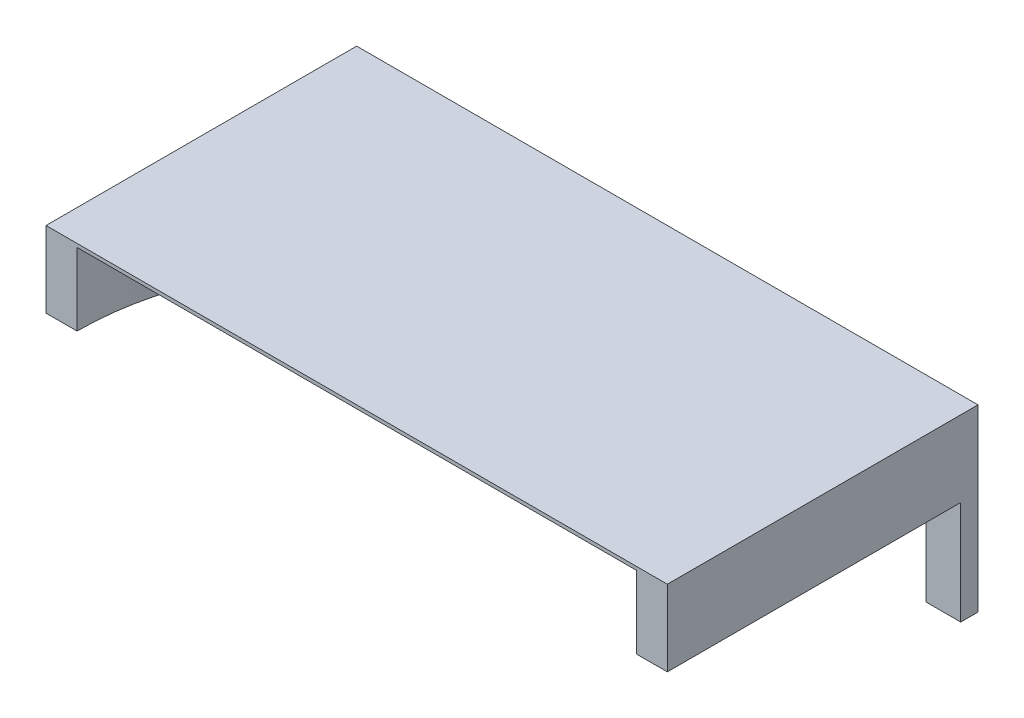
ISO-10303-21;
HEADER;
FILE_DESCRIPTION(('STEP AP214'),'2;1');
FILE_NAME('part.step','',(''),(''),'','','');
FILE_SCHEMA(('AUTOMOTIVE_DESIGN { 1 0 10303 214 1 1 1 1 }'));
ENDSEC;
DATA;
#1=APPLICATION_CONTEXT('core data for automotive mechanical design processes');
#2=APPLICATION_PROTOCOL_DEFINITION('international standard','automotive_design',2000,#1);
#3=PRODUCT_CONTEXT('',#1,'mechanical');
#4=PRODUCT('Part','Part','',(#3));
#5=PRODUCT_RELATED_PRODUCT_CATEGORY('part','',(#4));
#6=PRODUCT_DEFINITION_FORMATION('','',#4);
#7=PRODUCT_DEFINITION_CONTEXT('part definition',#1,'design');
#8=PRODUCT_DEFINITION('design','',#6,#7);
#9=PRODUCT_DEFINITION_SHAPE('','',#8);
#10=(LENGTH_UNIT() NAMED_UNIT(*) SI_UNIT(.MILLI.,.METRE.));
#11=(NAMED_UNIT(*) PLANE_ANGLE_UNIT() SI_UNIT($,.RADIAN.));
#12=(NAMED_UNIT(*) SI_UNIT($,.STERADIAN.) SOLID_ANGLE_UNIT());
#13=UNCERTAINTY_MEASURE_WITH_UNIT(LENGTH_MEASURE(1.E-05),#10,'distance_accuracy_value','');
#14=(GEOMETRIC_REPRESENTATION_CONTEXT(3) GLOBAL_UNCERTAINTY_ASSIGNED_CONTEXT((#13)) GLOBAL_UNIT_ASSIGNED_CONTEXT((#10,
#11,#12)) REPRESENTATION_CONTEXT('',''));
#15=CARTESIAN_POINT('',(0.,0.,0.));
#16=DIRECTION('',(0.,0.,1.));
#17=DIRECTION('',(1.,0.,0.));
#18=AXIS2_PLACEMENT_3D('',#15,#16,#17);
#19=CARTESIAN_POINT('',(0.,0.,90.));
#20=DIRECTION('',(0.,1.,0.));
#21=DIRECTION('',(0.,0.,1.));
#22=AXIS2_PLACEMENT_3D('',#19,#20,#21);
#23=PLANE('',#22);
#24=DIRECTION('',(-1.,0.,0.));
#25=VECTOR('',#24,1.);
#26=CARTESIAN_POINT('',(90.,0.,0.));
#27=LINE('',#26,#25);
#28=CARTESIAN_POINT('',(70.,0.,0.));
#29=VERTEX_POINT('',#28);
#30=CARTESIAN_POINT('',(-70.,0.,0.));
#31=VERTEX_POINT('',#30);
#32=EDGE_CURVE('E230',#29,#31,#27,.T.);
#33=ORIENTED_EDGE('',*,*,#32,.F.);
#34=DIRECTION('',(0.,0.,-1.));
#35=VECTOR('',#34,1.);
#36=CARTESIAN_POINT('',(70.,0.,5.));
#37=LINE('',#36,#35);
#38=CARTESIAN_POINT('',(70.,0.,5.));
#39=VERTEX_POINT('',#38);
#40=EDGE_CURVE('E270',#29,#39,#37,.F.);
#41=ORIENTED_EDGE('',*,*,#40,.T.);
#42=DIRECTION('',(-1.,0.,0.));
#43=VECTOR('',#42,1.);
#44=CARTESIAN_POINT('',(90.,0.,5.));
#45=LINE('',#44,#43);
#46=CARTESIAN_POINT('',(90.,0.,5.));
#47=VERTEX_POINT('',#46);
#48=EDGE_CURVE('E163',#47,#39,#45,.T.);
#49=ORIENTED_EDGE('',*,*,#48,.F.);
#50=DIRECTION('',(0.,0.,-1.));
#51=VECTOR('',#50,1.);
#52=CARTESIAN_POINT('',(90.,0.,90.));
#53=LINE('',#52,#51);
#54=CARTESIAN_POINT('',(90.,0.,90.));
#55=VERTEX_POINT('',#54);
#56=EDGE_CURVE('E168',#55,#47,#53,.T.);
#57=ORIENTED_EDGE('',*,*,#56,.F.);
#58=DIRECTION('',(1.,0.,0.));
#59=VECTOR('',#58,1.);
#60=CARTESIAN_POINT('',(81.,0.,90.));
#61=LINE('',#60,#59);
#62=CARTESIAN_POINT('',(81.,0.,90.));
#63=VERTEX_POINT('',#62);
#64=EDGE_CURVE('E208',#63,#55,#61,.T.);
#65=ORIENTED_EDGE('',*,*,#64,.F.);
#66=CARTESIAN_POINT('',(0.,0.,90.));
#67=DIRECTION('',(0.,1.,0.));
#68=DIRECTION('',(0.,0.,1.));
#69=AXIS2_PLACEMENT_3D('',#66,#67,#68);
#70=CIRCLE('',#69,81.);
#71=CARTESIAN_POINT('',(-81.,0.,90.));
#72=VERTEX_POINT('',#71);
#73=EDGE_CURVE('E214',#63,#72,#70,.T.);
#74=ORIENTED_EDGE('',*,*,#73,.T.);
#75=DIRECTION('',(-1.,0.,0.));
#76=VECTOR('',#75,1.);
#77=CARTESIAN_POINT('',(-81.,0.,90.));
#78=LINE('',#77,#76);
#79=CARTESIAN_POINT('',(-90.,0.,90.));
#80=VERTEX_POINT('',#79);
#81=EDGE_CURVE('E236',#72,#80,#78,.T.);
#82=ORIENTED_EDGE('',*,*,#81,.T.);
#83=DIRECTION('',(0.,0.,-1.));
#84=VECTOR('',#83,1.);
#85=CARTESIAN_POINT('',(-90.,0.,90.));
#86=LINE('',#85,#84);
#87=CARTESIAN_POINT('',(-90.,0.,5.00000000000006));
#88=VERTEX_POINT('',#87);
#89=EDGE_CURVE('E233',#80,#88,#86,.T.);
#90=ORIENTED_EDGE('',*,*,#89,.T.);
#91=DIRECTION('',(-1.,0.,0.));
#92=VECTOR('',#91,1.);
#93=CARTESIAN_POINT('',(-90.,0.,5.00000000000003));
#94=LINE('',#93,#92);
#95=CARTESIAN_POINT('',(-70.,0.,5.00000000000003));
#96=VERTEX_POINT('',#95);
#97=EDGE_CURVE('E170',#96,#88,#94,.T.);
#98=ORIENTED_EDGE('',*,*,#97,.F.);
#99=DIRECTION('',(0.,0.,1.));
#100=VECTOR('',#99,1.);
#101=CARTESIAN_POINT('',(-70.,0.,0.));
#102=LINE('',#101,#100);
#103=EDGE_CURVE('E267',#96,#31,#102,.F.);
#104=ORIENTED_EDGE('',*,*,#103,.T.);
#105=EDGE_LOOP('',(#33,#41,#49,#57,#65,#74,#82,#90,#98,#104));
#106=FACE_BOUND('',#105,.T.);
#107=ADVANCED_FACE('F39',(#106),#23,.F.);
#108=CARTESIAN_POINT('',(0.,22.,90.));
#109=DIRECTION('',(0.,-1.,0.));
#110=DIRECTION('',(0.,0.,-1.));
#111=AXIS2_PLACEMENT_3D('',#108,#109,#110);
#112=CYLINDRICAL_SURFACE('',#111,81.);
#113=DIRECTION('',(0.,-1.,0.));
#114=VECTOR('',#113,1.);
#115=CARTESIAN_POINT('',(81.,22.,90.));
#116=LINE('',#115,#114);
#117=CARTESIAN_POINT('',(81.,21.,90.));
#118=VERTEX_POINT('',#117);
#119=EDGE_CURVE('E224',#118,#63,#116,.T.);
#120=ORIENTED_EDGE('',*,*,#119,.F.);
#121=CARTESIAN_POINT('',(0.,21.,90.));
#122=DIRECTION('',(0.,1.,0.));
#123=DIRECTION('',(0.,0.,1.));
#124=AXIS2_PLACEMENT_3D('',#121,#122,#123);
#125=CIRCLE('',#124,81.);
#126=CARTESIAN_POINT('',(-81.,21.,90.));
#127=VERTEX_POINT('',#126);
#128=EDGE_CURVE('E260',#118,#127,#125,.T.);
#129=ORIENTED_EDGE('',*,*,#128,.T.);
#130=DIRECTION('',(0.,-1.,0.));
#131=VECTOR('',#130,1.);
#132=CARTESIAN_POINT('',(-81.,22.,90.));
#133=LINE('',#132,#131);
#134=EDGE_CURVE('E245',#127,#72,#133,.T.);
#135=ORIENTED_EDGE('',*,*,#134,.T.);
#136=ORIENTED_EDGE('',*,*,#73,.F.);
#137=EDGE_LOOP('',(#120,#129,#135,#136));
#138=FACE_BOUND('',#137,.T.);
#139=ADVANCED_FACE('F316',(#138),#112,.F.);
#140=CARTESIAN_POINT('',(90.,22.,90.));
#141=DIRECTION('',(-1.,0.,0.));
#142=DIRECTION('',(0.,0.,1.));
#143=AXIS2_PLACEMENT_3D('',#140,#141,#142);
#144=PLANE('',#143);
#145=DIRECTION('',(0.,-1.,0.));
#146=VECTOR('',#145,1.);
#147=CARTESIAN_POINT('',(90.,22.,90.));
#148=LINE('',#147,#146);
#149=CARTESIAN_POINT('',(90.,22.,90.));
#150=VERTEX_POINT('',#149);
#151=EDGE_CURVE('E257',#150,#55,#148,.T.);
#152=ORIENTED_EDGE('',*,*,#151,.T.);
#153=ORIENTED_EDGE('',*,*,#56,.T.);
#154=DIRECTION('',(0.,1.,0.));
#155=VECTOR('',#154,1.);
#156=CARTESIAN_POINT('',(90.,-30.,5.));
#157=LINE('',#156,#155);
#158=CARTESIAN_POINT('',(90.,-30.,5.));
#159=VERTEX_POINT('',#158);
#160=EDGE_CURVE('E145',#159,#47,#157,.T.);
#161=ORIENTED_EDGE('',*,*,#160,.F.);
#162=DIRECTION('',(0.,0.,1.));
#163=VECTOR('',#162,1.);
#164=CARTESIAN_POINT('',(90.,-30.,0.));
#165=LINE('',#164,#163);
#166=CARTESIAN_POINT('',(90.,-30.,0.));
#167=VERTEX_POINT('',#166);
#168=EDGE_CURVE('E153',#167,#159,#165,.T.);
#169=ORIENTED_EDGE('',*,*,#168,.F.);
#170=DIRECTION('',(0.,-1.,0.));
#171=VECTOR('',#170,1.);
#172=CARTESIAN_POINT('',(90.,22.,0.));
#173=LINE('',#172,#171);
#174=CARTESIAN_POINT('',(90.,22.,0.));
#175=VERTEX_POINT('',#174);
#176=EDGE_CURVE('E254',#175,#167,#173,.T.);
#177=ORIENTED_EDGE('',*,*,#176,.F.);
#178=DIRECTION('',(0.,0.,-1.));
#179=VECTOR('',#178,1.);
#180=CARTESIAN_POINT('',(90.,22.,90.));
#181=LINE('',#180,#179);
#182=EDGE_CURVE('E213',#150,#175,#181,.T.);
#183=ORIENTED_EDGE('',*,*,#182,.F.);
#184=EDGE_LOOP('',(#152,#153,#161,#169,#177,#183));
#185=FACE_BOUND('',#184,.T.);
#186=ADVANCED_FACE('F166',(#185),#144,.F.);
#187=CARTESIAN_POINT('',(90.,22.,0.));
#188=DIRECTION('',(0.,0.,1.));
#189=DIRECTION('',(1.,0.,0.));
#190=AXIS2_PLACEMENT_3D('',#187,#188,#189);
#191=PLANE('',#190);
#192=ORIENTED_EDGE('',*,*,#176,.T.);
#193=DIRECTION('',(1.,0.,0.));
#194=VECTOR('',#193,1.);
#195=CARTESIAN_POINT('',(90.,-30.,0.));
#196=LINE('',#195,#194);
#197=CARTESIAN_POINT('',(80.,-30.,0.));
#198=VERTEX_POINT('',#197);
#199=EDGE_CURVE('E159',#198,#167,#196,.T.);
#200=ORIENTED_EDGE('',*,*,#199,.F.);
#201=DIRECTION('',(0.,1.,0.));
#202=VECTOR('',#201,1.);
#203=CARTESIAN_POINT('',(80.,-30.,0.));
#204=LINE('',#203,#202);
#205=CARTESIAN_POINT('',(80.,-10.,0.));
#206=VERTEX_POINT('',#205);
#207=EDGE_CURVE('E177',#198,#206,#204,.T.);
#208=ORIENTED_EDGE('',*,*,#207,.T.);
#209=CARTESIAN_POINT('',(70.,-10.,0.));
#210=DIRECTION('',(0.,0.,1.));
#211=DIRECTION('',(1.,0.,0.));
#212=AXIS2_PLACEMENT_3D('',#209,#210,#211);
#213=CIRCLE('',#212,10.);
#214=EDGE_CURVE('E277',#206,#29,#213,.T.);
#215=ORIENTED_EDGE('',*,*,#214,.T.);
#216=ORIENTED_EDGE('',*,*,#32,.T.);
#217=CARTESIAN_POINT('',(-70.,-10.,0.));
#218=DIRECTION('',(0.,0.,1.));
#219=DIRECTION('',(1.,0.,0.));
#220=AXIS2_PLACEMENT_3D('',#217,#218,#219);
#221=CIRCLE('',#220,10.);
#222=CARTESIAN_POINT('',(-80.,-10.,0.));
#223=VERTEX_POINT('',#222);
#224=EDGE_CURVE('E11',#31,#223,#221,.T.);
#225=ORIENTED_EDGE('',*,*,#224,.T.);
#226=DIRECTION('',(0.,1.,0.));
#227=VECTOR('',#226,1.);
#228=CARTESIAN_POINT('',(-80.,-30.,0.));
#229=LINE('',#228,#227);
#230=CARTESIAN_POINT('',(-80.,-30.,0.));
#231=VERTEX_POINT('',#230);
#232=EDGE_CURVE('E201',#231,#223,#229,.T.);
#233=ORIENTED_EDGE('',*,*,#232,.F.);
#234=DIRECTION('',(1.,0.,0.));
#235=VECTOR('',#234,1.);
#236=CARTESIAN_POINT('',(-90.,-30.,0.));
#237=LINE('',#236,#235);
#238=CARTESIAN_POINT('',(-90.,-30.,0.));
#239=VERTEX_POINT('',#238);
#240=EDGE_CURVE('E184',#239,#231,#237,.T.);
#241=ORIENTED_EDGE('',*,*,#240,.F.);
#242=DIRECTION('',(0.,-1.,0.));
#243=VECTOR('',#242,1.);
#244=CARTESIAN_POINT('',(-90.,22.,0.));
#245=LINE('',#244,#243);
#246=CARTESIAN_POINT('',(-90.,22.,0.));
#247=VERTEX_POINT('',#246);
#248=EDGE_CURVE('E251',#247,#239,#245,.T.);
#249=ORIENTED_EDGE('',*,*,#248,.F.);
#250=DIRECTION('',(-1.,0.,0.));
#251=VECTOR('',#250,1.);
#252=CARTESIAN_POINT('',(90.,22.,0.));
#253=LINE('',#252,#251);
#254=EDGE_CURVE('E217',#175,#247,#253,.T.);
#255=ORIENTED_EDGE('',*,*,#254,.F.);
#256=EDGE_LOOP('',(#192,#200,#208,#215,#216,#225,#233,#241,#249,#255));
#257=FACE_BOUND('',#256,.T.);
#258=ADVANCED_FACE('F291',(#257),#191,.F.);
#259=CARTESIAN_POINT('',(-90.,22.,90.));
#260=DIRECTION('',(-1.,0.,0.));
#261=DIRECTION('',(0.,0.,1.));
#262=AXIS2_PLACEMENT_3D('',#259,#260,#261);
#263=PLANE('',#262);
#264=ORIENTED_EDGE('',*,*,#248,.T.);
#265=DIRECTION('',(0.,0.,-1.));
#266=VECTOR('',#265,1.);
#267=CARTESIAN_POINT('',(-90.,-30.,0.));
#268=LINE('',#267,#266);
#269=CARTESIAN_POINT('',(-90.,-30.,5.00000000000003));
#270=VERTEX_POINT('',#269);
#271=EDGE_CURVE('E175',#270,#239,#268,.T.);
#272=ORIENTED_EDGE('',*,*,#271,.F.);
#273=DIRECTION('',(0.,1.,0.));
#274=VECTOR('',#273,1.);
#275=CARTESIAN_POINT('',(-90.,-30.,5.00000000000003));
#276=LINE('',#275,#274);
#277=EDGE_CURVE('E192',#270,#88,#276,.T.);
#278=ORIENTED_EDGE('',*,*,#277,.T.);
#279=ORIENTED_EDGE('',*,*,#89,.F.);
#280=DIRECTION('',(0.,-1.,0.));
#281=VECTOR('',#280,1.);
#282=CARTESIAN_POINT('',(-90.,22.,90.));
#283=LINE('',#282,#281);
#284=CARTESIAN_POINT('',(-90.,22.,90.));
#285=VERTEX_POINT('',#284);
#286=EDGE_CURVE('E248',#285,#80,#283,.T.);
#287=ORIENTED_EDGE('',*,*,#286,.F.);
#288=DIRECTION('',(0.,0.,-1.));
#289=VECTOR('',#288,1.);
#290=CARTESIAN_POINT('',(-90.,22.,90.));
#291=LINE('',#290,#289);
#292=EDGE_CURVE('E220',#285,#247,#291,.T.);
#293=ORIENTED_EDGE('',*,*,#292,.T.);
#294=EDGE_LOOP('',(#264,#272,#278,#279,#287,#293));
#295=FACE_BOUND('',#294,.T.);
#296=ADVANCED_FACE('F342',(#295),#263,.T.);
#297=CARTESIAN_POINT('',(-81.,22.,90.));
#298=DIRECTION('',(0.,0.,1.));
#299=DIRECTION('',(1.,0.,0.));
#300=AXIS2_PLACEMENT_3D('',#297,#298,#299);
#301=PLANE('',#300);
#302=ORIENTED_EDGE('',*,*,#286,.T.);
#303=ORIENTED_EDGE('',*,*,#81,.F.);
#304=ORIENTED_EDGE('',*,*,#134,.F.);
#305=DIRECTION('',(1.,0.,0.));
#306=VECTOR('',#305,1.);
#307=CARTESIAN_POINT('',(-90.,21.,90.));
#308=LINE('',#307,#306);
#309=EDGE_CURVE('E204',#127,#118,#308,.T.);
#310=ORIENTED_EDGE('',*,*,#309,.T.);
#311=ORIENTED_EDGE('',*,*,#119,.T.);
#312=ORIENTED_EDGE('',*,*,#64,.T.);
#313=ORIENTED_EDGE('',*,*,#151,.F.);
#314=DIRECTION('',(1.,0.,0.));
#315=VECTOR('',#314,1.);
#316=CARTESIAN_POINT('',(81.,22.,90.));
#317=LINE('',#316,#315);
#318=EDGE_CURVE('E209',#285,#150,#317,.T.);
#319=ORIENTED_EDGE('',*,*,#318,.F.);
#320=EDGE_LOOP('',(#302,#303,#304,#310,#311,#312,#313,#319));
#321=FACE_BOUND('',#320,.T.);
#322=ADVANCED_FACE('F311',(#321),#301,.T.);
#323=CARTESIAN_POINT('',(0.,22.,90.));
#324=DIRECTION('',(0.,1.,0.));
#325=DIRECTION('',(0.,0.,1.));
#326=AXIS2_PLACEMENT_3D('',#323,#324,#325);
#327=PLANE('',#326);
#328=ORIENTED_EDGE('',*,*,#318,.T.);
#329=ORIENTED_EDGE('',*,*,#182,.T.);
#330=ORIENTED_EDGE('',*,*,#254,.T.);
#331=ORIENTED_EDGE('',*,*,#292,.F.);
#332=EDGE_LOOP('',(#328,#329,#330,#331));
#333=FACE_BOUND('',#332,.T.);
#334=ADVANCED_FACE('F321',(#333),#327,.T.);
#335=CARTESIAN_POINT('',(0.,21.,0.));
#336=DIRECTION('',(0.,1.,0.));
#337=DIRECTION('',(0.,0.,1.));
#338=AXIS2_PLACEMENT_3D('',#335,#336,#337);
#339=PLANE('',#338);
#340=ORIENTED_EDGE('',*,*,#128,.F.);
#341=ORIENTED_EDGE('',*,*,#309,.F.);
#342=EDGE_LOOP('',(#340,#341));
#343=FACE_BOUND('',#342,.T.);
#344=ADVANCED_FACE('F318',(#343),#339,.F.);
#345=CARTESIAN_POINT('',(-80.,-30.,0.));
#346=DIRECTION('',(-1.,0.,0.));
#347=DIRECTION('',(0.,0.,1.));
#348=AXIS2_PLACEMENT_3D('',#345,#346,#347);
#349=PLANE('',#348);
#350=ORIENTED_EDGE('',*,*,#232,.T.);
#351=DIRECTION('',(0.,0.,1.));
#352=VECTOR('',#351,1.);
#353=CARTESIAN_POINT('',(-80.,-10.,5.00000000000003));
#354=LINE('',#353,#352);
#355=CARTESIAN_POINT('',(-80.,-10.,5.00000000000003));
#356=VERTEX_POINT('',#355);
#357=EDGE_CURVE('E274',#223,#356,#354,.T.);
#358=ORIENTED_EDGE('',*,*,#357,.T.);
#359=DIRECTION('',(0.,1.,0.));
#360=VECTOR('',#359,1.);
#361=CARTESIAN_POINT('',(-80.,-30.,5.00000000000003));
#362=LINE('',#361,#360);
#363=CARTESIAN_POINT('',(-80.,-30.,5.00000000000003));
#364=VERTEX_POINT('',#363);
#365=EDGE_CURVE('E197',#364,#356,#362,.T.);
#366=ORIENTED_EDGE('',*,*,#365,.F.);
#367=DIRECTION('',(0.,0.,1.));
#368=VECTOR('',#367,1.);
#369=CARTESIAN_POINT('',(-80.,-30.,0.));
#370=LINE('',#369,#368);
#371=EDGE_CURVE('E187',#231,#364,#370,.T.);
#372=ORIENTED_EDGE('',*,*,#371,.F.);
#373=EDGE_LOOP('',(#350,#358,#366,#372));
#374=FACE_BOUND('',#373,.T.);
#375=ADVANCED_FACE('F320',(#374),#349,.F.);
#376=CARTESIAN_POINT('',(-90.,-30.,5.00000000000003));
#377=DIRECTION('',(0.,0.,-1.));
#378=DIRECTION('',(-1.,0.,0.));
#379=AXIS2_PLACEMENT_3D('',#376,#377,#378);
#380=PLANE('',#379);
#381=ORIENTED_EDGE('',*,*,#97,.T.);
#382=ORIENTED_EDGE('',*,*,#277,.F.);
#383=DIRECTION('',(-1.,0.,0.));
#384=VECTOR('',#383,1.);
#385=CARTESIAN_POINT('',(-90.,-30.,5.00000000000003));
#386=LINE('',#385,#384);
#387=EDGE_CURVE('E190',#364,#270,#386,.T.);
#388=ORIENTED_EDGE('',*,*,#387,.F.);
#389=ORIENTED_EDGE('',*,*,#365,.T.);
#390=CARTESIAN_POINT('',(-70.,-10.,5.00000000000003));
#391=DIRECTION('',(0.,0.,-1.));
#392=DIRECTION('',(-1.,0.,0.));
#393=AXIS2_PLACEMENT_3D('',#390,#391,#392);
#394=CIRCLE('',#393,10.);
#395=EDGE_CURVE('E48',#356,#96,#394,.T.);
#396=ORIENTED_EDGE('',*,*,#395,.T.);
#397=EDGE_LOOP('',(#381,#382,#388,#389,#396));
#398=FACE_BOUND('',#397,.T.);
#399=ADVANCED_FACE('F284',(#398),#380,.F.);
#400=CARTESIAN_POINT('',(0.,-30.,0.));
#401=DIRECTION('',(0.,1.,0.));
#402=DIRECTION('',(0.,0.,1.));
#403=AXIS2_PLACEMENT_3D('',#400,#401,#402);
#404=PLANE('',#403);
#405=ORIENTED_EDGE('',*,*,#271,.T.);
#406=ORIENTED_EDGE('',*,*,#240,.T.);
#407=ORIENTED_EDGE('',*,*,#371,.T.);
#408=ORIENTED_EDGE('',*,*,#387,.T.);
#409=EDGE_LOOP('',(#405,#406,#407,#408));
#410=FACE_BOUND('',#409,.T.);
#411=ADVANCED_FACE('F361',(#410),#404,.F.);
#412=CARTESIAN_POINT('',(90.,-30.,5.));
#413=DIRECTION('',(0.,0.,-1.));
#414=DIRECTION('',(-1.,0.,0.));
#415=AXIS2_PLACEMENT_3D('',#412,#413,#414);
#416=PLANE('',#415);
#417=ORIENTED_EDGE('',*,*,#48,.T.);
#418=CARTESIAN_POINT('',(70.,-10.,5.));
#419=DIRECTION('',(0.,0.,-1.));
#420=DIRECTION('',(-1.,0.,0.));
#421=AXIS2_PLACEMENT_3D('',#418,#419,#420);
#422=CIRCLE('',#421,10.);
#423=CARTESIAN_POINT('',(80.,-10.,5.));
#424=VERTEX_POINT('',#423);
#425=EDGE_CURVE('E280',#39,#424,#422,.T.);
#426=ORIENTED_EDGE('',*,*,#425,.T.);
#427=DIRECTION('',(0.,1.,0.));
#428=VECTOR('',#427,1.);
#429=CARTESIAN_POINT('',(80.,-30.,5.));
#430=LINE('',#429,#428);
#431=CARTESIAN_POINT('',(80.,-30.,5.));
#432=VERTEX_POINT('',#431);
#433=EDGE_CURVE('E148',#432,#424,#430,.T.);
#434=ORIENTED_EDGE('',*,*,#433,.F.);
#435=DIRECTION('',(-1.,0.,0.));
#436=VECTOR('',#435,1.);
#437=CARTESIAN_POINT('',(90.,-30.,5.));
#438=LINE('',#437,#436);
#439=EDGE_CURVE('E141',#159,#432,#438,.T.);
#440=ORIENTED_EDGE('',*,*,#439,.F.);
#441=ORIENTED_EDGE('',*,*,#160,.T.);
#442=EDGE_LOOP('',(#417,#426,#434,#440,#441));
#443=FACE_BOUND('',#442,.T.);
#444=ADVANCED_FACE('F143',(#443),#416,.F.);
#445=CARTESIAN_POINT('',(80.,-30.,0.));
#446=DIRECTION('',(1.,0.,0.));
#447=DIRECTION('',(0.,0.,-1.));
#448=AXIS2_PLACEMENT_3D('',#445,#446,#447);
#449=PLANE('',#448);
#450=ORIENTED_EDGE('',*,*,#433,.T.);
#451=DIRECTION('',(0.,0.,-1.));
#452=VECTOR('',#451,1.);
#453=CARTESIAN_POINT('',(80.,-10.,0.));
#454=LINE('',#453,#452);
#455=EDGE_CURVE('E263',#424,#206,#454,.T.);
#456=ORIENTED_EDGE('',*,*,#455,.T.);
#457=ORIENTED_EDGE('',*,*,#207,.F.);
#458=DIRECTION('',(0.,0.,-1.));
#459=VECTOR('',#458,1.);
#460=CARTESIAN_POINT('',(80.,-30.,0.));
#461=LINE('',#460,#459);
#462=EDGE_CURVE('E152',#432,#198,#461,.T.);
#463=ORIENTED_EDGE('',*,*,#462,.F.);
#464=EDGE_LOOP('',(#450,#456,#457,#463));
#465=FACE_BOUND('',#464,.T.);
#466=ADVANCED_FACE('F299',(#465),#449,.F.);
#467=CARTESIAN_POINT('',(0.,-30.,0.));
#468=DIRECTION('',(0.,-1.,0.));
#469=DIRECTION('',(0.,0.,-1.));
#470=AXIS2_PLACEMENT_3D('',#467,#468,#469);
#471=PLANE('',#470);
#472=ORIENTED_EDGE('',*,*,#168,.T.);
#473=ORIENTED_EDGE('',*,*,#439,.T.);
#474=ORIENTED_EDGE('',*,*,#462,.T.);
#475=ORIENTED_EDGE('',*,*,#199,.T.);
#476=EDGE_LOOP('',(#472,#473,#474,#475));
#477=FACE_BOUND('',#476,.T.);
#478=ADVANCED_FACE('F157',(#477),#471,.T.);
#479=CARTESIAN_POINT('',(70.,-10.,0.));
#480=DIRECTION('',(0.,0.,1.));
#481=DIRECTION('',(1.,0.,0.));
#482=AXIS2_PLACEMENT_3D('',#479,#480,#481);
#483=CYLINDRICAL_SURFACE('',#482,10.);
#484=ORIENTED_EDGE('',*,*,#425,.F.);
#485=ORIENTED_EDGE('',*,*,#40,.F.);
#486=ORIENTED_EDGE('',*,*,#214,.F.);
#487=ORIENTED_EDGE('',*,*,#455,.F.);
#488=EDGE_LOOP('',(#484,#485,#486,#487));
#489=FACE_BOUND('',#488,.T.);
#490=ADVANCED_FACE('F297',(#489),#483,.F.);
#491=CARTESIAN_POINT('',(-70.,-10.,0.));
#492=DIRECTION('',(0.,0.,-1.));
#493=DIRECTION('',(-1.,0.,0.));
#494=AXIS2_PLACEMENT_3D('',#491,#492,#493);
#495=CYLINDRICAL_SURFACE('',#494,10.);
#496=ORIENTED_EDGE('',*,*,#224,.F.);
#497=ORIENTED_EDGE('',*,*,#103,.F.);
#498=ORIENTED_EDGE('',*,*,#395,.F.);
#499=ORIENTED_EDGE('',*,*,#357,.F.);
#500=EDGE_LOOP('',(#496,#497,#498,#499));
#501=FACE_BOUND('',#500,.T.);
#502=ADVANCED_FACE('F41',(#501),#495,.F.);
#503=CLOSED_SHELL('',(#107,#139,#186,#258,#296,#322,#334,#344,#375,#399,#411,#444,#466,#478,
#490,#502));
#504=MANIFOLD_SOLID_BREP('B2',#503);
#505=ADVANCED_BREP_SHAPE_REPRESENTATION('',(#18,#504),#14);
#506=SHAPE_DEFINITION_REPRESENTATION(#9,#505);
ENDSEC;
END-ISO-10303-21;
